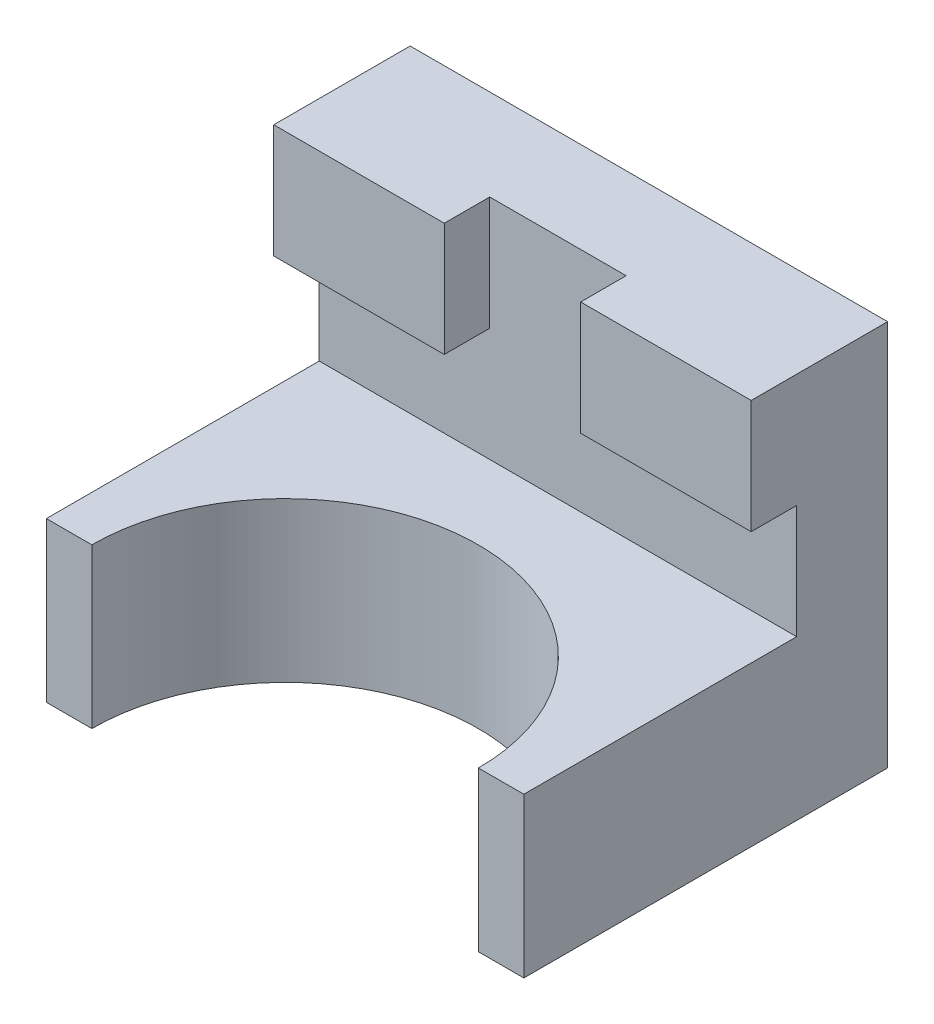
ISO-10303-21;
HEADER;
FILE_DESCRIPTION(('STEP AP214'),'2;1');
FILE_NAME('part.step','',(''),(''),'','','');
FILE_SCHEMA(('AUTOMOTIVE_DESIGN { 1 0 10303 214 1 1 1 1 }'));
ENDSEC;
DATA;
#1=APPLICATION_CONTEXT('core data for automotive mechanical design processes');
#2=APPLICATION_PROTOCOL_DEFINITION('international standard','automotive_design',2000,#1);
#3=PRODUCT_CONTEXT('',#1,'mechanical');
#4=PRODUCT('Part','Part','',(#3));
#5=PRODUCT_RELATED_PRODUCT_CATEGORY('part','',(#4));
#6=PRODUCT_DEFINITION_FORMATION('','',#4);
#7=PRODUCT_DEFINITION_CONTEXT('part definition',#1,'design');
#8=PRODUCT_DEFINITION('design','',#6,#7);
#9=PRODUCT_DEFINITION_SHAPE('','',#8);
#10=(LENGTH_UNIT() NAMED_UNIT(*) SI_UNIT(.MILLI.,.METRE.));
#11=(NAMED_UNIT(*) PLANE_ANGLE_UNIT() SI_UNIT($,.RADIAN.));
#12=(NAMED_UNIT(*) SI_UNIT($,.STERADIAN.) SOLID_ANGLE_UNIT());
#13=UNCERTAINTY_MEASURE_WITH_UNIT(LENGTH_MEASURE(1.E-05),#10,'distance_accuracy_value','');
#14=(GEOMETRIC_REPRESENTATION_CONTEXT(3) GLOBAL_UNCERTAINTY_ASSIGNED_CONTEXT((#13)) GLOBAL_UNIT_ASSIGNED_CONTEXT((#10,
#11,#12)) REPRESENTATION_CONTEXT('',''));
#15=CARTESIAN_POINT('',(0.,0.,0.));
#16=DIRECTION('',(0.,0.,1.));
#17=DIRECTION('',(1.,0.,0.));
#18=AXIS2_PLACEMENT_3D('',#15,#16,#17);
#19=CARTESIAN_POINT('',(105.,-85.,80.));
#20=DIRECTION('',(0.,0.,-1.));
#21=DIRECTION('',(-1.,0.,0.));
#22=AXIS2_PLACEMENT_3D('',#19,#20,#21);
#23=PLANE('',#22);
#24=DIRECTION('',(-1.,0.,0.));
#25=VECTOR('',#24,1.);
#26=CARTESIAN_POINT('',(105.,-85.,80.));
#27=LINE('',#26,#25);
#28=CARTESIAN_POINT('',(9.99999999999999,-85.,80.));
#29=VERTEX_POINT('',#28);
#30=CARTESIAN_POINT('',(0.,-85.,80.));
#31=VERTEX_POINT('',#30);
#32=EDGE_CURVE('E157',#29,#31,#27,.T.);
#33=ORIENTED_EDGE('',*,*,#32,.F.);
#34=DIRECTION('',(0.,1.,0.));
#35=VECTOR('',#34,1.);
#36=CARTESIAN_POINT('',(9.99999999999999,-85.,80.));
#37=LINE('',#36,#35);
#38=CARTESIAN_POINT('',(9.99999999999999,-50.,80.));
#39=VERTEX_POINT('',#38);
#40=EDGE_CURVE('E50',#29,#39,#37,.T.);
#41=ORIENTED_EDGE('',*,*,#40,.T.);
#42=DIRECTION('',(-1.,0.,0.));
#43=VECTOR('',#42,1.);
#44=CARTESIAN_POINT('',(105.,-50.,80.));
#45=LINE('',#44,#43);
#46=CARTESIAN_POINT('',(0.,-50.,80.));
#47=VERTEX_POINT('',#46);
#48=EDGE_CURVE('E156',#39,#47,#45,.T.);
#49=ORIENTED_EDGE('',*,*,#48,.T.);
#50=DIRECTION('',(0.,-1.,0.));
#51=VECTOR('',#50,1.);
#52=CARTESIAN_POINT('',(0.,-85.,80.));
#53=LINE('',#52,#51);
#54=EDGE_CURVE('E207',#47,#31,#53,.T.);
#55=ORIENTED_EDGE('',*,*,#54,.T.);
#56=EDGE_LOOP('',(#33,#41,#49,#55));
#57=FACE_BOUND('',#56,.T.);
#58=ADVANCED_FACE('F35',(#57),#23,.F.);
#59=CARTESIAN_POINT('',(105.,0.,30.));
#60=DIRECTION('',(0.,0.,-1.));
#61=DIRECTION('',(0.,1.,0.));
#62=AXIS2_PLACEMENT_3D('',#59,#60,#61);
#63=PLANE('',#62);
#64=DIRECTION('',(-1.,0.,0.));
#65=VECTOR('',#64,1.);
#66=CARTESIAN_POINT('',(105.,-25.,30.));
#67=LINE('',#66,#65);
#68=CARTESIAN_POINT('',(37.5,-25.,30.));
#69=VERTEX_POINT('',#68);
#70=CARTESIAN_POINT('',(0.,-25.,30.));
#71=VERTEX_POINT('',#70);
#72=EDGE_CURVE('E170',#69,#71,#67,.T.);
#73=ORIENTED_EDGE('',*,*,#72,.F.);
#74=DIRECTION('',(0.,1.,0.));
#75=VECTOR('',#74,1.);
#76=CARTESIAN_POINT('',(37.5,-25.,30.));
#77=LINE('',#76,#75);
#78=CARTESIAN_POINT('',(37.5,0.,30.));
#79=VERTEX_POINT('',#78);
#80=EDGE_CURVE('E228',#69,#79,#77,.T.);
#81=ORIENTED_EDGE('',*,*,#80,.T.);
#82=DIRECTION('',(-1.,0.,0.));
#83=VECTOR('',#82,1.);
#84=CARTESIAN_POINT('',(105.,0.,30.));
#85=LINE('',#84,#83);
#86=CARTESIAN_POINT('',(0.,0.,30.));
#87=VERTEX_POINT('',#86);
#88=EDGE_CURVE('E43',#79,#87,#85,.T.);
#89=ORIENTED_EDGE('',*,*,#88,.T.);
#90=DIRECTION('',(0.,-1.,0.));
#91=VECTOR('',#90,1.);
#92=CARTESIAN_POINT('',(0.,0.,30.));
#93=LINE('',#92,#91);
#94=EDGE_CURVE('E189',#87,#71,#93,.T.);
#95=ORIENTED_EDGE('',*,*,#94,.T.);
#96=EDGE_LOOP('',(#73,#81,#89,#95));
#97=FACE_BOUND('',#96,.T.);
#98=ADVANCED_FACE('F190',(#97),#63,.F.);
#99=CARTESIAN_POINT('',(105.,-25.,20.));
#100=DIRECTION('',(0.,1.,0.));
#101=DIRECTION('',(0.,0.,1.));
#102=AXIS2_PLACEMENT_3D('',#99,#100,#101);
#103=PLANE('',#102);
#104=DIRECTION('',(-1.,0.,0.));
#105=VECTOR('',#104,1.);
#106=CARTESIAN_POINT('',(105.,-25.,20.));
#107=LINE('',#106,#105);
#108=CARTESIAN_POINT('',(37.5,-25.,20.));
#109=VERTEX_POINT('',#108);
#110=CARTESIAN_POINT('',(0.,-25.,20.));
#111=VERTEX_POINT('',#110);
#112=EDGE_CURVE('E167',#109,#111,#107,.T.);
#113=ORIENTED_EDGE('',*,*,#112,.F.);
#114=DIRECTION('',(0.,0.,1.));
#115=VECTOR('',#114,1.);
#116=CARTESIAN_POINT('',(37.5,-25.,30.));
#117=LINE('',#116,#115);
#118=EDGE_CURVE('E58',#109,#69,#117,.T.);
#119=ORIENTED_EDGE('',*,*,#118,.T.);
#120=ORIENTED_EDGE('',*,*,#72,.T.);
#121=DIRECTION('',(0.,0.,-1.));
#122=VECTOR('',#121,1.);
#123=CARTESIAN_POINT('',(0.,-25.,20.));
#124=LINE('',#123,#122);
#125=EDGE_CURVE('E184',#71,#111,#124,.T.);
#126=ORIENTED_EDGE('',*,*,#125,.T.);
#127=EDGE_LOOP('',(#113,#119,#120,#126));
#128=FACE_BOUND('',#127,.T.);
#129=ADVANCED_FACE('F182',(#128),#103,.F.);
#130=CARTESIAN_POINT('',(105.,0.,0.));
#131=DIRECTION('',(0.,-1.,0.));
#132=DIRECTION('',(0.,0.,-1.));
#133=AXIS2_PLACEMENT_3D('',#130,#131,#132);
#134=PLANE('',#133);
#135=ORIENTED_EDGE('',*,*,#88,.F.);
#136=DIRECTION('',(0.,0.,1.));
#137=VECTOR('',#136,1.);
#138=CARTESIAN_POINT('',(37.5,0.,30.));
#139=LINE('',#138,#137);
#140=CARTESIAN_POINT('',(37.5,0.,20.));
#141=VERTEX_POINT('',#140);
#142=EDGE_CURVE('E234',#141,#79,#139,.T.);
#143=ORIENTED_EDGE('',*,*,#142,.F.);
#144=DIRECTION('',(-1.,0.,0.));
#145=VECTOR('',#144,1.);
#146=CARTESIAN_POINT('',(37.5,0.,20.));
#147=LINE('',#146,#145);
#148=CARTESIAN_POINT('',(67.5,0.,20.));
#149=VERTEX_POINT('',#148);
#150=EDGE_CURVE('E263',#149,#141,#147,.T.);
#151=ORIENTED_EDGE('',*,*,#150,.F.);
#152=DIRECTION('',(0.,0.,-1.));
#153=VECTOR('',#152,1.);
#154=CARTESIAN_POINT('',(67.5,0.,20.));
#155=LINE('',#154,#153);
#156=CARTESIAN_POINT('',(67.5,0.,30.));
#157=VERTEX_POINT('',#156);
#158=EDGE_CURVE('E258',#157,#149,#155,.T.);
#159=ORIENTED_EDGE('',*,*,#158,.F.);
#160=CARTESIAN_POINT('',(105.,0.,30.));
#161=VERTEX_POINT('',#160);
#162=EDGE_CURVE('E11',#161,#157,#85,.T.);
#163=ORIENTED_EDGE('',*,*,#162,.F.);
#164=DIRECTION('',(0.,0.,1.));
#165=VECTOR('',#164,1.);
#166=CARTESIAN_POINT('',(105.,0.,0.));
#167=LINE('',#166,#165);
#168=CARTESIAN_POINT('',(105.,0.,0.));
#169=VERTEX_POINT('',#168);
#170=EDGE_CURVE('E213',#169,#161,#167,.T.);
#171=ORIENTED_EDGE('',*,*,#170,.F.);
#172=DIRECTION('',(-1.,0.,0.));
#173=VECTOR('',#172,1.);
#174=CARTESIAN_POINT('',(105.,0.,0.));
#175=LINE('',#174,#173);
#176=CARTESIAN_POINT('',(0.,0.,0.));
#177=VERTEX_POINT('',#176);
#178=EDGE_CURVE('E214',#169,#177,#175,.T.);
#179=ORIENTED_EDGE('',*,*,#178,.T.);
#180=DIRECTION('',(0.,0.,1.));
#181=VECTOR('',#180,1.);
#182=CARTESIAN_POINT('',(0.,0.,0.));
#183=LINE('',#182,#181);
#184=EDGE_CURVE('E195',#177,#87,#183,.T.);
#185=ORIENTED_EDGE('',*,*,#184,.T.);
#186=EDGE_LOOP('',(#135,#143,#151,#159,#163,#171,#179,#185));
#187=FACE_BOUND('',#186,.T.);
#188=ADVANCED_FACE('F37',(#187),#134,.F.);
#189=ORIENTED_EDGE('',*,*,#162,.T.);
#190=DIRECTION('',(0.,1.,0.));
#191=VECTOR('',#190,1.);
#192=CARTESIAN_POINT('',(67.5,-25.,30.));
#193=LINE('',#192,#191);
#194=CARTESIAN_POINT('',(67.5,-25.,30.));
#195=VERTEX_POINT('',#194);
#196=EDGE_CURVE('E238',#195,#157,#193,.T.);
#197=ORIENTED_EDGE('',*,*,#196,.F.);
#198=CARTESIAN_POINT('',(105.,-25.,30.));
#199=VERTEX_POINT('',#198);
#200=EDGE_CURVE('E171',#199,#195,#67,.T.);
#201=ORIENTED_EDGE('',*,*,#200,.F.);
#202=DIRECTION('',(0.,-1.,0.));
#203=VECTOR('',#202,1.);
#204=CARTESIAN_POINT('',(105.,0.,30.));
#205=LINE('',#204,#203);
#206=EDGE_CURVE('E241',#161,#199,#205,.T.);
#207=ORIENTED_EDGE('',*,*,#206,.F.);
#208=EDGE_LOOP('',(#189,#197,#201,#207));
#209=FACE_BOUND('',#208,.T.);
#210=ADVANCED_FACE('F274',(#209),#63,.F.);
#211=ORIENTED_EDGE('',*,*,#200,.T.);
#212=DIRECTION('',(0.,0.,-1.));
#213=VECTOR('',#212,1.);
#214=CARTESIAN_POINT('',(67.5,-25.,20.));
#215=LINE('',#214,#213);
#216=CARTESIAN_POINT('',(67.5,-25.,20.));
#217=VERTEX_POINT('',#216);
#218=EDGE_CURVE('E259',#195,#217,#215,.T.);
#219=ORIENTED_EDGE('',*,*,#218,.T.);
#220=CARTESIAN_POINT('',(105.,-25.,20.));
#221=VERTEX_POINT('',#220);
#222=EDGE_CURVE('E168',#221,#217,#107,.T.);
#223=ORIENTED_EDGE('',*,*,#222,.F.);
#224=DIRECTION('',(0.,0.,-1.));
#225=VECTOR('',#224,1.);
#226=CARTESIAN_POINT('',(105.,-25.,20.));
#227=LINE('',#226,#225);
#228=EDGE_CURVE('E243',#199,#221,#227,.T.);
#229=ORIENTED_EDGE('',*,*,#228,.F.);
#230=EDGE_LOOP('',(#211,#219,#223,#229));
#231=FACE_BOUND('',#230,.T.);
#232=ADVANCED_FACE('F276',(#231),#103,.F.);
#233=CARTESIAN_POINT('',(105.,-50.,20.));
#234=DIRECTION('',(0.,0.,-1.));
#235=DIRECTION('',(-1.,0.,0.));
#236=AXIS2_PLACEMENT_3D('',#233,#234,#235);
#237=PLANE('',#236);
#238=DIRECTION('',(0.,-1.,0.));
#239=VECTOR('',#238,1.);
#240=CARTESIAN_POINT('',(0.,-50.,20.));
#241=LINE('',#240,#239);
#242=CARTESIAN_POINT('',(0.,-50.,20.));
#243=VERTEX_POINT('',#242);
#244=EDGE_CURVE('E199',#111,#243,#241,.T.);
#245=ORIENTED_EDGE('',*,*,#244,.T.);
#246=DIRECTION('',(-1.,0.,0.));
#247=VECTOR('',#246,1.);
#248=CARTESIAN_POINT('',(105.,-50.,20.));
#249=LINE('',#248,#247);
#250=CARTESIAN_POINT('',(105.,-50.,20.));
#251=VERTEX_POINT('',#250);
#252=EDGE_CURVE('E164',#251,#243,#249,.T.);
#253=ORIENTED_EDGE('',*,*,#252,.F.);
#254=DIRECTION('',(0.,-1.,0.));
#255=VECTOR('',#254,1.);
#256=CARTESIAN_POINT('',(105.,-50.,20.));
#257=LINE('',#256,#255);
#258=EDGE_CURVE('E245',#221,#251,#257,.T.);
#259=ORIENTED_EDGE('',*,*,#258,.F.);
#260=ORIENTED_EDGE('',*,*,#222,.T.);
#261=DIRECTION('',(0.,1.,0.));
#262=VECTOR('',#261,1.);
#263=CARTESIAN_POINT('',(67.5,-25.,20.));
#264=LINE('',#263,#262);
#265=EDGE_CURVE('E231',#217,#149,#264,.T.);
#266=ORIENTED_EDGE('',*,*,#265,.T.);
#267=ORIENTED_EDGE('',*,*,#150,.T.);
#268=DIRECTION('',(0.,1.,0.));
#269=VECTOR('',#268,1.);
#270=CARTESIAN_POINT('',(37.5,-25.,20.));
#271=LINE('',#270,#269);
#272=EDGE_CURVE('E229',#109,#141,#271,.T.);
#273=ORIENTED_EDGE('',*,*,#272,.F.);
#274=ORIENTED_EDGE('',*,*,#112,.T.);
#275=EDGE_LOOP('',(#245,#253,#259,#260,#266,#267,#273,#274));
#276=FACE_BOUND('',#275,.T.);
#277=ADVANCED_FACE('F277',(#276),#237,.F.);
#278=CARTESIAN_POINT('',(105.,-50.,80.));
#279=DIRECTION('',(0.,-1.,0.));
#280=DIRECTION('',(0.,0.,-1.));
#281=AXIS2_PLACEMENT_3D('',#278,#279,#280);
#282=PLANE('',#281);
#283=ORIENTED_EDGE('',*,*,#48,.F.);
#284=CARTESIAN_POINT('',(52.5,-50.,80.));
#285=DIRECTION('',(0.,1.,0.));
#286=DIRECTION('',(0.,0.,1.));
#287=AXIS2_PLACEMENT_3D('',#284,#285,#286);
#288=CIRCLE('',#287,42.5);
#289=CARTESIAN_POINT('',(95.,-50.,80.));
#290=VERTEX_POINT('',#289);
#291=EDGE_CURVE('E141',#290,#39,#288,.T.);
#292=ORIENTED_EDGE('',*,*,#291,.F.);
#293=CARTESIAN_POINT('',(105.,-50.,80.));
#294=VERTEX_POINT('',#293);
#295=EDGE_CURVE('E151',#294,#290,#45,.T.);
#296=ORIENTED_EDGE('',*,*,#295,.F.);
#297=DIRECTION('',(0.,0.,1.));
#298=VECTOR('',#297,1.);
#299=CARTESIAN_POINT('',(105.,-50.,80.));
#300=LINE('',#299,#298);
#301=EDGE_CURVE('E247',#251,#294,#300,.T.);
#302=ORIENTED_EDGE('',*,*,#301,.F.);
#303=ORIENTED_EDGE('',*,*,#252,.T.);
#304=DIRECTION('',(0.,0.,1.));
#305=VECTOR('',#304,1.);
#306=CARTESIAN_POINT('',(0.,-50.,80.));
#307=LINE('',#306,#305);
#308=EDGE_CURVE('E201',#243,#47,#307,.T.);
#309=ORIENTED_EDGE('',*,*,#308,.T.);
#310=EDGE_LOOP('',(#283,#292,#296,#302,#303,#309));
#311=FACE_BOUND('',#310,.T.);
#312=ADVANCED_FACE('F254',(#311),#282,.F.);
#313=ORIENTED_EDGE('',*,*,#295,.T.);
#314=DIRECTION('',(0.,1.,0.));
#315=VECTOR('',#314,1.);
#316=CARTESIAN_POINT('',(95.,-85.,80.));
#317=LINE('',#316,#315);
#318=CARTESIAN_POINT('',(95.,-85.,80.));
#319=VERTEX_POINT('',#318);
#320=EDGE_CURVE('E136',#290,#319,#317,.F.);
#321=ORIENTED_EDGE('',*,*,#320,.T.);
#322=CARTESIAN_POINT('',(105.,-85.,80.));
#323=VERTEX_POINT('',#322);
#324=EDGE_CURVE('E148',#323,#319,#27,.T.);
#325=ORIENTED_EDGE('',*,*,#324,.F.);
#326=DIRECTION('',(0.,-1.,0.));
#327=VECTOR('',#326,1.);
#328=CARTESIAN_POINT('',(105.,-85.,80.));
#329=LINE('',#328,#327);
#330=EDGE_CURVE('E225',#294,#323,#329,.T.);
#331=ORIENTED_EDGE('',*,*,#330,.F.);
#332=EDGE_LOOP('',(#313,#321,#325,#331));
#333=FACE_BOUND('',#332,.T.);
#334=ADVANCED_FACE('F146',(#333),#23,.F.);
#335=CARTESIAN_POINT('',(105.,-85.,0.));
#336=DIRECTION('',(0.,1.,0.));
#337=DIRECTION('',(0.,0.,1.));
#338=AXIS2_PLACEMENT_3D('',#335,#336,#337);
#339=PLANE('',#338);
#340=ORIENTED_EDGE('',*,*,#324,.T.);
#341=CARTESIAN_POINT('',(52.5,-85.,80.));
#342=DIRECTION('',(0.,1.,0.));
#343=DIRECTION('',(0.,0.,1.));
#344=AXIS2_PLACEMENT_3D('',#341,#342,#343);
#345=CIRCLE('',#344,42.5);
#346=EDGE_CURVE('E133',#319,#29,#345,.T.);
#347=ORIENTED_EDGE('',*,*,#346,.T.);
#348=ORIENTED_EDGE('',*,*,#32,.T.);
#349=DIRECTION('',(0.,0.,-1.));
#350=VECTOR('',#349,1.);
#351=CARTESIAN_POINT('',(0.,-85.,0.));
#352=LINE('',#351,#350);
#353=CARTESIAN_POINT('',(0.,-85.,0.));
#354=VERTEX_POINT('',#353);
#355=EDGE_CURVE('E210',#31,#354,#352,.T.);
#356=ORIENTED_EDGE('',*,*,#355,.T.);
#357=DIRECTION('',(-1.,0.,0.));
#358=VECTOR('',#357,1.);
#359=CARTESIAN_POINT('',(105.,-85.,0.));
#360=LINE('',#359,#358);
#361=CARTESIAN_POINT('',(105.,-85.,0.));
#362=VERTEX_POINT('',#361);
#363=EDGE_CURVE('E160',#362,#354,#360,.T.);
#364=ORIENTED_EDGE('',*,*,#363,.F.);
#365=DIRECTION('',(0.,0.,-1.));
#366=VECTOR('',#365,1.);
#367=CARTESIAN_POINT('',(105.,-85.,0.));
#368=LINE('',#367,#366);
#369=EDGE_CURVE('E155',#323,#362,#368,.T.);
#370=ORIENTED_EDGE('',*,*,#369,.F.);
#371=EDGE_LOOP('',(#340,#347,#348,#356,#364,#370));
#372=FACE_BOUND('',#371,.T.);
#373=ADVANCED_FACE('F153',(#372),#339,.F.);
#374=CARTESIAN_POINT('',(105.,0.,0.));
#375=DIRECTION('',(0.,0.,1.));
#376=DIRECTION('',(1.,0.,0.));
#377=AXIS2_PLACEMENT_3D('',#374,#375,#376);
#378=PLANE('',#377);
#379=DIRECTION('',(0.,1.,0.));
#380=VECTOR('',#379,1.);
#381=CARTESIAN_POINT('',(0.,0.,0.));
#382=LINE('',#381,#380);
#383=EDGE_CURVE('E212',#354,#177,#382,.T.);
#384=ORIENTED_EDGE('',*,*,#383,.T.);
#385=ORIENTED_EDGE('',*,*,#178,.F.);
#386=DIRECTION('',(0.,1.,0.));
#387=VECTOR('',#386,1.);
#388=CARTESIAN_POINT('',(105.,0.,0.));
#389=LINE('',#388,#387);
#390=EDGE_CURVE('E216',#362,#169,#389,.T.);
#391=ORIENTED_EDGE('',*,*,#390,.F.);
#392=ORIENTED_EDGE('',*,*,#363,.T.);
#393=EDGE_LOOP('',(#384,#385,#391,#392));
#394=FACE_BOUND('',#393,.T.);
#395=ADVANCED_FACE('F283',(#394),#378,.F.);
#396=CARTESIAN_POINT('',(105.,0.,0.));
#397=DIRECTION('',(1.,0.,0.));
#398=DIRECTION('',(0.,0.,-1.));
#399=AXIS2_PLACEMENT_3D('',#396,#397,#398);
#400=PLANE('',#399);
#401=ORIENTED_EDGE('',*,*,#170,.T.);
#402=ORIENTED_EDGE('',*,*,#206,.T.);
#403=ORIENTED_EDGE('',*,*,#228,.T.);
#404=ORIENTED_EDGE('',*,*,#258,.T.);
#405=ORIENTED_EDGE('',*,*,#301,.T.);
#406=ORIENTED_EDGE('',*,*,#330,.T.);
#407=ORIENTED_EDGE('',*,*,#369,.T.);
#408=ORIENTED_EDGE('',*,*,#390,.T.);
#409=EDGE_LOOP('',(#401,#402,#403,#404,#405,#406,#407,#408));
#410=FACE_BOUND('',#409,.T.);
#411=ADVANCED_FACE('F248',(#410),#400,.T.);
#412=CARTESIAN_POINT('',(0.,0.,0.));
#413=DIRECTION('',(1.,0.,0.));
#414=DIRECTION('',(0.,0.,-1.));
#415=AXIS2_PLACEMENT_3D('',#412,#413,#414);
#416=PLANE('',#415);
#417=ORIENTED_EDGE('',*,*,#184,.F.);
#418=ORIENTED_EDGE('',*,*,#383,.F.);
#419=ORIENTED_EDGE('',*,*,#355,.F.);
#420=ORIENTED_EDGE('',*,*,#54,.F.);
#421=ORIENTED_EDGE('',*,*,#308,.F.);
#422=ORIENTED_EDGE('',*,*,#244,.F.);
#423=ORIENTED_EDGE('',*,*,#125,.F.);
#424=ORIENTED_EDGE('',*,*,#94,.F.);
#425=EDGE_LOOP('',(#417,#418,#419,#420,#421,#422,#423,#424));
#426=FACE_BOUND('',#425,.T.);
#427=ADVANCED_FACE('F197',(#426),#416,.F.);
#428=CARTESIAN_POINT('',(37.5,-25.,30.));
#429=DIRECTION('',(-1.,0.,0.));
#430=DIRECTION('',(0.,0.,1.));
#431=AXIS2_PLACEMENT_3D('',#428,#429,#430);
#432=PLANE('',#431);
#433=ORIENTED_EDGE('',*,*,#142,.T.);
#434=ORIENTED_EDGE('',*,*,#80,.F.);
#435=ORIENTED_EDGE('',*,*,#118,.F.);
#436=ORIENTED_EDGE('',*,*,#272,.T.);
#437=EDGE_LOOP('',(#433,#434,#435,#436));
#438=FACE_BOUND('',#437,.T.);
#439=ADVANCED_FACE('F268',(#438),#432,.F.);
#440=CARTESIAN_POINT('',(67.5,-25.,20.));
#441=DIRECTION('',(1.,0.,0.));
#442=DIRECTION('',(0.,0.,-1.));
#443=AXIS2_PLACEMENT_3D('',#440,#441,#442);
#444=PLANE('',#443);
#445=ORIENTED_EDGE('',*,*,#158,.T.);
#446=ORIENTED_EDGE('',*,*,#265,.F.);
#447=ORIENTED_EDGE('',*,*,#218,.F.);
#448=ORIENTED_EDGE('',*,*,#196,.T.);
#449=EDGE_LOOP('',(#445,#446,#447,#448));
#450=FACE_BOUND('',#449,.T.);
#451=ADVANCED_FACE('F385',(#450),#444,.F.);
#452=CARTESIAN_POINT('',(52.5,-85.,80.));
#453=DIRECTION('',(0.,1.,0.));
#454=DIRECTION('',(0.,0.,1.));
#455=AXIS2_PLACEMENT_3D('',#452,#453,#454);
#456=CYLINDRICAL_SURFACE('',#455,42.5);
#457=ORIENTED_EDGE('',*,*,#346,.F.);
#458=ORIENTED_EDGE('',*,*,#320,.F.);
#459=ORIENTED_EDGE('',*,*,#291,.T.);
#460=ORIENTED_EDGE('',*,*,#40,.F.);
#461=EDGE_LOOP('',(#457,#458,#459,#460));
#462=FACE_BOUND('',#461,.T.);
#463=ADVANCED_FACE('F135',(#462),#456,.F.);
#464=CLOSED_SHELL('',(#58,#98,#129,#188,#210,#232,#277,#312,#334,#373,#395,#411,#427,#439,#451,#463));
#465=MANIFOLD_SOLID_BREP('B2',#464);
#466=ADVANCED_BREP_SHAPE_REPRESENTATION('',(#18,#465),#14);
#467=SHAPE_DEFINITION_REPRESENTATION(#9,#466);
ENDSEC;
END-ISO-10303-21;
